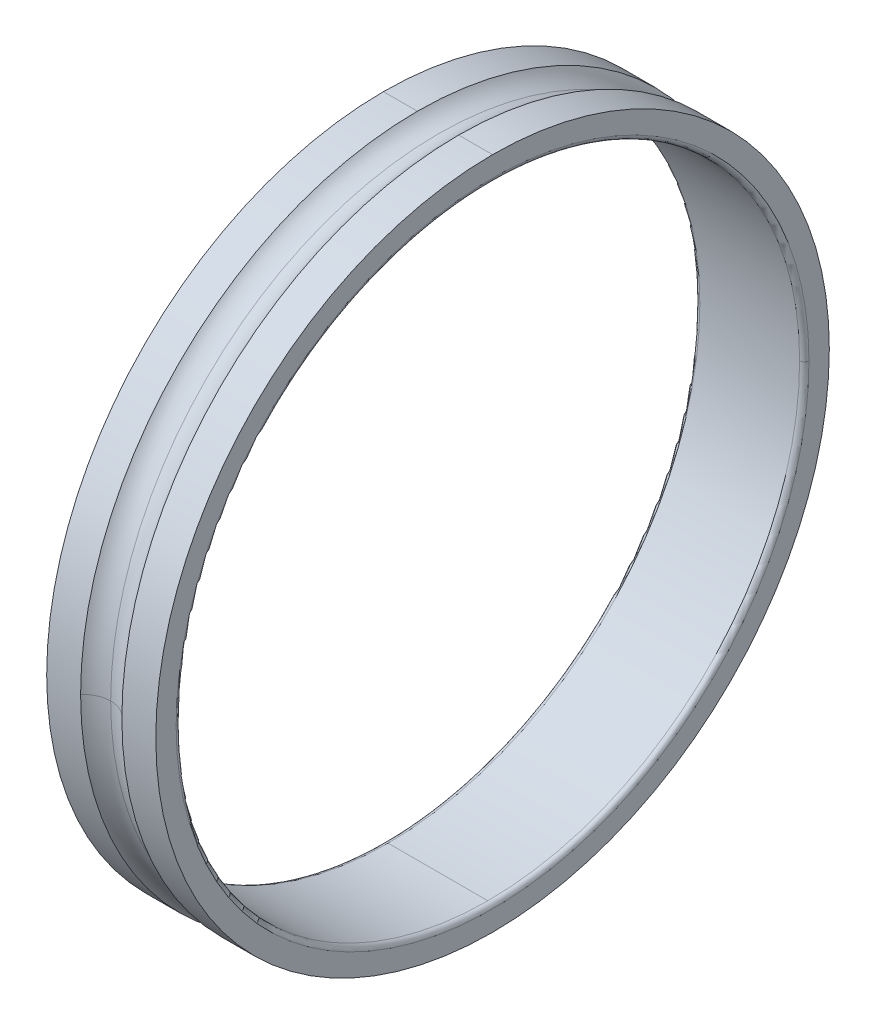
ISO-10303-21;
HEADER;
FILE_DESCRIPTION(('STEP AP214'),'2;1');
FILE_NAME('part.step','',(''),(''),'','','');
FILE_SCHEMA(('AUTOMOTIVE_DESIGN { 1 0 10303 214 1 1 1 1 }'));
ENDSEC;
DATA;
#1=APPLICATION_CONTEXT('core data for automotive mechanical design processes');
#2=APPLICATION_PROTOCOL_DEFINITION('international standard','automotive_design',2000,#1);
#3=PRODUCT_CONTEXT('',#1,'mechanical');
#4=PRODUCT('Part','Part','',(#3));
#5=PRODUCT_RELATED_PRODUCT_CATEGORY('part','',(#4));
#6=PRODUCT_DEFINITION_FORMATION('','',#4);
#7=PRODUCT_DEFINITION_CONTEXT('part definition',#1,'design');
#8=PRODUCT_DEFINITION('design','',#6,#7);
#9=PRODUCT_DEFINITION_SHAPE('','',#8);
#10=(LENGTH_UNIT() NAMED_UNIT(*) SI_UNIT(.MILLI.,.METRE.));
#11=(NAMED_UNIT(*) PLANE_ANGLE_UNIT() SI_UNIT($,.RADIAN.));
#12=(NAMED_UNIT(*) SI_UNIT($,.STERADIAN.) SOLID_ANGLE_UNIT());
#13=UNCERTAINTY_MEASURE_WITH_UNIT(LENGTH_MEASURE(1.E-05),#10,'distance_accuracy_value','');
#14=(GEOMETRIC_REPRESENTATION_CONTEXT(3) GLOBAL_UNCERTAINTY_ASSIGNED_CONTEXT((#13)) GLOBAL_UNIT_ASSIGNED_CONTEXT((#10,
#11,#12)) REPRESENTATION_CONTEXT('',''));
#15=CARTESIAN_POINT('',(0.,0.,0.));
#16=DIRECTION('',(0.,0.,1.));
#17=DIRECTION('',(1.,0.,0.));
#18=AXIS2_PLACEMENT_3D('',#15,#16,#17);
#19=CARTESIAN_POINT('',(5.91171651785338,0.,0.));
#20=DIRECTION('',(1.,0.,0.));
#21=DIRECTION('',(0.,1.,0.));
#22=AXIS2_PLACEMENT_3D('',#19,#20,#21);
#23=CYLINDRICAL_SURFACE('',#22,21.605);
#24=DIRECTION('',(1.,0.,0.));
#25=VECTOR('',#24,1.);
#26=CARTESIAN_POINT('',(5.91171651785338,21.605,0.));
#27=LINE('',#26,#25);
#28=CARTESIAN_POINT('',(4.82343303570677,21.605,0.));
#29=VERTEX_POINT('',#28);
#30=CARTESIAN_POINT('',(7.,21.605,0.));
#31=VERTEX_POINT('',#30);
#32=EDGE_CURVE('E158',#29,#31,#27,.T.);
#33=ORIENTED_EDGE('',*,*,#32,.T.);
#34=CARTESIAN_POINT('',(7.,0.,0.));
#35=DIRECTION('',(1.,0.,0.));
#36=DIRECTION('',(0.,1.,0.));
#37=AXIS2_PLACEMENT_3D('',#34,#35,#36);
#38=CIRCLE('',#37,21.605);
#39=CARTESIAN_POINT('',(7.,-21.605,0.));
#40=VERTEX_POINT('',#39);
#41=EDGE_CURVE('E168',#40,#31,#38,.T.);
#42=ORIENTED_EDGE('',*,*,#41,.F.);
#43=DIRECTION('',(-1.,0.,0.));
#44=VECTOR('',#43,1.);
#45=CARTESIAN_POINT('',(5.91171651785338,-21.605,0.));
#46=LINE('',#45,#44);
#47=CARTESIAN_POINT('',(4.82343303570677,-21.605,0.));
#48=VERTEX_POINT('',#47);
#49=EDGE_CURVE('E153',#40,#48,#46,.T.);
#50=ORIENTED_EDGE('',*,*,#49,.T.);
#51=CARTESIAN_POINT('',(4.82343303570677,0.,0.));
#52=DIRECTION('',(1.,0.,0.));
#53=DIRECTION('',(0.,1.,0.));
#54=AXIS2_PLACEMENT_3D('',#51,#52,#53);
#55=CIRCLE('',#54,21.605);
#56=CARTESIAN_POINT('',(4.82343303570677,0.,-21.605));
#57=VERTEX_POINT('',#56);
#58=EDGE_CURVE('E134',#48,#57,#55,.T.);
#59=ORIENTED_EDGE('',*,*,#58,.T.);
#60=CARTESIAN_POINT('',(4.82343303570677,0.,0.));
#61=DIRECTION('',(1.,0.,0.));
#62=DIRECTION('',(0.,1.,0.));
#63=AXIS2_PLACEMENT_3D('',#60,#61,#62);
#64=CIRCLE('',#63,21.605);
#65=EDGE_CURVE('E157',#57,#29,#64,.T.);
#66=ORIENTED_EDGE('',*,*,#65,.T.);
#67=EDGE_LOOP('',(#33,#42,#50,#59,#66));
#68=FACE_BOUND('',#67,.T.);
#69=ADVANCED_FACE('F17',(#68),#23,.T.);
#70=CARTESIAN_POINT('',(3.5,0.,0.));
#71=DIRECTION('',(1.,0.,0.));
#72=DIRECTION('',(0.,0.,-1.));
#73=AXIS2_PLACEMENT_3D('',#70,#71,#72);
#74=TOROIDAL_SURFACE('',#73,22.75,1.75);
#75=CARTESIAN_POINT('',(3.5,0.,0.));
#76=DIRECTION('',(-1.,0.,0.));
#77=DIRECTION('',(0.,0.,1.));
#78=AXIS2_PLACEMENT_3D('',#75,#76,#77);
#79=CIRCLE('',#78,21.);
#80=CARTESIAN_POINT('',(3.5,0.,21.));
#81=VERTEX_POINT('',#80);
#82=CARTESIAN_POINT('',(3.5,0.,-21.));
#83=VERTEX_POINT('',#82);
#84=EDGE_CURVE('E116',#81,#83,#79,.T.);
#85=ORIENTED_EDGE('',*,*,#84,.T.);
#86=CARTESIAN_POINT('',(3.5,0.,-22.75));
#87=DIRECTION('',(0.,-1.,0.));
#88=DIRECTION('',(0.,0.,-1.));
#89=AXIS2_PLACEMENT_3D('',#86,#87,#88);
#90=CIRCLE('',#89,1.75);
#91=CARTESIAN_POINT('',(2.17656696429324,0.,-21.605));
#92=VERTEX_POINT('',#91);
#93=EDGE_CURVE('E130',#83,#92,#90,.T.);
#94=ORIENTED_EDGE('',*,*,#93,.T.);
#95=CARTESIAN_POINT('',(2.17656696429324,0.,0.));
#96=DIRECTION('',(1.,0.,0.));
#97=DIRECTION('',(0.,1.,0.));
#98=AXIS2_PLACEMENT_3D('',#95,#96,#97);
#99=CIRCLE('',#98,21.605);
#100=CARTESIAN_POINT('',(2.17656696429324,21.605,0.));
#101=VERTEX_POINT('',#100);
#102=EDGE_CURVE('E11',#92,#101,#99,.T.);
#103=ORIENTED_EDGE('',*,*,#102,.T.);
#104=CARTESIAN_POINT('',(2.17656696429324,0.,0.));
#105=DIRECTION('',(1.,0.,0.));
#106=DIRECTION('',(0.,1.,0.));
#107=AXIS2_PLACEMENT_3D('',#104,#105,#106);
#108=CIRCLE('',#107,21.605);
#109=CARTESIAN_POINT('',(2.17656696429324,0.,21.605));
#110=VERTEX_POINT('',#109);
#111=EDGE_CURVE('E118',#101,#110,#108,.T.);
#112=ORIENTED_EDGE('',*,*,#111,.T.);
#113=CARTESIAN_POINT('',(3.5,0.,22.75));
#114=DIRECTION('',(0.,-1.,0.));
#115=DIRECTION('',(0.,0.,1.));
#116=AXIS2_PLACEMENT_3D('',#113,#114,#115);
#117=CIRCLE('',#116,1.75);
#118=EDGE_CURVE('E111',#110,#81,#117,.T.);
#119=ORIENTED_EDGE('',*,*,#118,.T.);
#120=EDGE_LOOP('',(#85,#94,#103,#112,#119));
#121=FACE_BOUND('',#120,.T.);
#122=ADVANCED_FACE('F113',(#121),#74,.F.);
#123=CARTESIAN_POINT('',(1.08828348214662,0.,0.));
#124=DIRECTION('',(1.,0.,0.));
#125=DIRECTION('',(0.,1.,0.));
#126=AXIS2_PLACEMENT_3D('',#123,#124,#125);
#127=CYLINDRICAL_SURFACE('',#126,21.605);
#128=DIRECTION('',(1.,0.,0.));
#129=VECTOR('',#128,1.);
#130=CARTESIAN_POINT('',(1.08828348214662,21.605,0.));
#131=LINE('',#130,#129);
#132=CARTESIAN_POINT('',(0.,21.605,0.));
#133=VERTEX_POINT('',#132);
#134=EDGE_CURVE('E174',#133,#101,#131,.T.);
#135=ORIENTED_EDGE('',*,*,#134,.T.);
#136=ORIENTED_EDGE('',*,*,#102,.F.);
#137=CARTESIAN_POINT('',(2.17656696429324,0.,0.));
#138=DIRECTION('',(1.,0.,0.));
#139=DIRECTION('',(0.,1.,0.));
#140=AXIS2_PLACEMENT_3D('',#137,#138,#139);
#141=CIRCLE('',#140,21.605);
#142=CARTESIAN_POINT('',(2.17656696429324,-21.605,0.));
#143=VERTEX_POINT('',#142);
#144=EDGE_CURVE('E171',#143,#92,#141,.T.);
#145=ORIENTED_EDGE('',*,*,#144,.F.);
#146=DIRECTION('',(-1.,0.,0.));
#147=VECTOR('',#146,1.);
#148=CARTESIAN_POINT('',(1.08828348214662,-21.605,0.));
#149=LINE('',#148,#147);
#150=CARTESIAN_POINT('',(0.,-21.605,0.));
#151=VERTEX_POINT('',#150);
#152=EDGE_CURVE('E180',#143,#151,#149,.T.);
#153=ORIENTED_EDGE('',*,*,#152,.T.);
#154=CARTESIAN_POINT('',(0.,0.,0.));
#155=DIRECTION('',(1.,0.,0.));
#156=DIRECTION('',(0.,1.,0.));
#157=AXIS2_PLACEMENT_3D('',#154,#155,#156);
#158=CIRCLE('',#157,21.605);
#159=EDGE_CURVE('E25',#151,#133,#158,.T.);
#160=ORIENTED_EDGE('',*,*,#159,.T.);
#161=EDGE_LOOP('',(#135,#136,#145,#153,#160));
#162=FACE_BOUND('',#161,.T.);
#163=ADVANCED_FACE('F227',(#162),#127,.T.);
#164=CARTESIAN_POINT('',(0.,20.9525,0.));
#165=DIRECTION('',(-1.,0.,0.));
#166=DIRECTION('',(0.,0.,1.));
#167=AXIS2_PLACEMENT_3D('',#164,#165,#166);
#168=PLANE('',#167);
#169=CARTESIAN_POINT('',(0.,0.,0.));
#170=DIRECTION('',(1.,0.,0.));
#171=DIRECTION('',(0.,1.,0.));
#172=AXIS2_PLACEMENT_3D('',#169,#170,#171);
#173=CIRCLE('',#172,20.3);
#174=CARTESIAN_POINT('',(0.,0.,20.3));
#175=VERTEX_POINT('',#174);
#176=CARTESIAN_POINT('',(0.,0.,-20.3));
#177=VERTEX_POINT('',#176);
#178=EDGE_CURVE('E224',#175,#177,#173,.T.);
#179=ORIENTED_EDGE('',*,*,#178,.T.);
#180=CARTESIAN_POINT('',(0.,0.,0.));
#181=DIRECTION('',(1.,0.,0.));
#182=DIRECTION('',(0.,1.,0.));
#183=AXIS2_PLACEMENT_3D('',#180,#181,#182);
#184=CIRCLE('',#183,20.3);
#185=EDGE_CURVE('E196',#177,#175,#184,.T.);
#186=ORIENTED_EDGE('',*,*,#185,.T.);
#187=EDGE_LOOP('',(#179,#186));
#188=FACE_BOUND('',#187,.T.);
#189=CARTESIAN_POINT('',(0.,0.,0.));
#190=DIRECTION('',(1.,0.,0.));
#191=DIRECTION('',(0.,1.,0.));
#192=AXIS2_PLACEMENT_3D('',#189,#190,#191);
#193=CIRCLE('',#192,21.605);
#194=EDGE_CURVE('E177',#133,#151,#193,.T.);
#195=ORIENTED_EDGE('',*,*,#194,.F.);
#196=ORIENTED_EDGE('',*,*,#159,.F.);
#197=EDGE_LOOP('',(#195,#196));
#198=FACE_BOUND('',#197,.T.);
#199=ADVANCED_FACE('F231',(#188,#198),#168,.T.);
#200=CARTESIAN_POINT('',(0.3,0.,0.));
#201=DIRECTION('',(1.,0.,0.));
#202=DIRECTION('',(0.,0.,-1.));
#203=AXIS2_PLACEMENT_3D('',#200,#201,#202);
#204=TOROIDAL_SURFACE('',#203,20.3,0.3);
#205=CARTESIAN_POINT('',(0.3,0.,-20.3));
#206=DIRECTION('',(0.,-1.,0.));
#207=DIRECTION('',(0.,0.,-1.));
#208=AXIS2_PLACEMENT_3D('',#205,#206,#207);
#209=CIRCLE('',#208,0.3);
#210=CARTESIAN_POINT('',(0.3,0.,-20.));
#211=VERTEX_POINT('',#210);
#212=EDGE_CURVE('E184',#211,#177,#209,.T.);
#213=ORIENTED_EDGE('',*,*,#212,.T.);
#214=ORIENTED_EDGE('',*,*,#178,.F.);
#215=CARTESIAN_POINT('',(0.3,0.,20.3));
#216=DIRECTION('',(0.,-1.,0.));
#217=DIRECTION('',(0.,0.,1.));
#218=AXIS2_PLACEMENT_3D('',#215,#216,#217);
#219=CIRCLE('',#218,0.3);
#220=CARTESIAN_POINT('',(0.3,0.,20.));
#221=VERTEX_POINT('',#220);
#222=EDGE_CURVE('E193',#175,#221,#219,.T.);
#223=ORIENTED_EDGE('',*,*,#222,.T.);
#224=CARTESIAN_POINT('',(0.3,0.,0.));
#225=DIRECTION('',(1.,0.,0.));
#226=DIRECTION('',(0.,1.,0.));
#227=AXIS2_PLACEMENT_3D('',#224,#225,#226);
#228=CIRCLE('',#227,20.);
#229=CARTESIAN_POINT('',(0.3,-20.,0.));
#230=VERTEX_POINT('',#229);
#231=EDGE_CURVE('E166',#221,#230,#228,.T.);
#232=ORIENTED_EDGE('',*,*,#231,.T.);
#233=CARTESIAN_POINT('',(0.3,0.,0.));
#234=DIRECTION('',(1.,0.,0.));
#235=DIRECTION('',(0.,1.,0.));
#236=AXIS2_PLACEMENT_3D('',#233,#234,#235);
#237=CIRCLE('',#236,20.);
#238=EDGE_CURVE('E202',#230,#211,#237,.T.);
#239=ORIENTED_EDGE('',*,*,#238,.T.);
#240=EDGE_LOOP('',(#213,#214,#223,#232,#239));
#241=FACE_BOUND('',#240,.T.);
#242=ADVANCED_FACE('F260',(#241),#204,.T.);
#243=CARTESIAN_POINT('',(3.5,0.,0.));
#244=DIRECTION('',(1.,0.,0.));
#245=DIRECTION('',(0.,1.,0.));
#246=AXIS2_PLACEMENT_3D('',#243,#244,#245);
#247=CYLINDRICAL_SURFACE('',#246,20.);
#248=DIRECTION('',(1.,0.,0.));
#249=VECTOR('',#248,1.);
#250=CARTESIAN_POINT('',(3.5,20.,0.));
#251=LINE('',#250,#249);
#252=CARTESIAN_POINT('',(0.3,20.,0.));
#253=VERTEX_POINT('',#252);
#254=CARTESIAN_POINT('',(6.7,20.,0.));
#255=VERTEX_POINT('',#254);
#256=EDGE_CURVE('E199',#253,#255,#251,.T.);
#257=ORIENTED_EDGE('',*,*,#256,.T.);
#258=CARTESIAN_POINT('',(6.7,0.,0.));
#259=DIRECTION('',(1.,0.,0.));
#260=DIRECTION('',(0.,1.,0.));
#261=AXIS2_PLACEMENT_3D('',#258,#259,#260);
#262=CIRCLE('',#261,20.);
#263=CARTESIAN_POINT('',(6.7,0.,20.));
#264=VERTEX_POINT('',#263);
#265=EDGE_CURVE('E220',#255,#264,#262,.T.);
#266=ORIENTED_EDGE('',*,*,#265,.T.);
#267=CARTESIAN_POINT('',(6.7,0.,0.));
#268=DIRECTION('',(1.,0.,0.));
#269=DIRECTION('',(0.,1.,0.));
#270=AXIS2_PLACEMENT_3D('',#267,#268,#269);
#271=CIRCLE('',#270,20.);
#272=CARTESIAN_POINT('',(6.7,-20.,0.));
#273=VERTEX_POINT('',#272);
#274=EDGE_CURVE('E32',#264,#273,#271,.T.);
#275=ORIENTED_EDGE('',*,*,#274,.T.);
#276=DIRECTION('',(-1.,0.,0.));
#277=VECTOR('',#276,1.);
#278=CARTESIAN_POINT('',(3.5,-20.,0.));
#279=LINE('',#278,#277);
#280=EDGE_CURVE('E204',#273,#230,#279,.T.);
#281=ORIENTED_EDGE('',*,*,#280,.T.);
#282=ORIENTED_EDGE('',*,*,#231,.F.);
#283=CARTESIAN_POINT('',(0.3,0.,0.));
#284=DIRECTION('',(1.,0.,0.));
#285=DIRECTION('',(0.,1.,0.));
#286=AXIS2_PLACEMENT_3D('',#283,#284,#285);
#287=CIRCLE('',#286,20.);
#288=EDGE_CURVE('E190',#253,#221,#287,.T.);
#289=ORIENTED_EDGE('',*,*,#288,.F.);
#290=EDGE_LOOP('',(#257,#266,#275,#281,#282,#289));
#291=FACE_BOUND('',#290,.T.);
#292=ADVANCED_FACE('F19',(#291),#247,.F.);
#293=CARTESIAN_POINT('',(6.7,0.,0.));
#294=DIRECTION('',(1.,0.,0.));
#295=DIRECTION('',(0.,0.,-1.));
#296=AXIS2_PLACEMENT_3D('',#293,#294,#295);
#297=TOROIDAL_SURFACE('',#296,20.3,0.3);
#298=CARTESIAN_POINT('',(6.7,0.,-20.3));
#299=DIRECTION('',(0.,-1.,0.));
#300=DIRECTION('',(0.,0.,-1.));
#301=AXIS2_PLACEMENT_3D('',#298,#299,#300);
#302=CIRCLE('',#301,0.3);
#303=CARTESIAN_POINT('',(7.,0.,-20.3));
#304=VERTEX_POINT('',#303);
#305=CARTESIAN_POINT('',(6.7,0.,-20.));
#306=VERTEX_POINT('',#305);
#307=EDGE_CURVE('E213',#304,#306,#302,.T.);
#308=ORIENTED_EDGE('',*,*,#307,.T.);
#309=CARTESIAN_POINT('',(6.7,0.,0.));
#310=DIRECTION('',(1.,0.,0.));
#311=DIRECTION('',(0.,1.,0.));
#312=AXIS2_PLACEMENT_3D('',#309,#310,#311);
#313=CIRCLE('',#312,20.);
#314=EDGE_CURVE('E207',#273,#306,#313,.T.);
#315=ORIENTED_EDGE('',*,*,#314,.F.);
#316=ORIENTED_EDGE('',*,*,#274,.F.);
#317=CARTESIAN_POINT('',(6.7,0.,20.3));
#318=DIRECTION('',(0.,-1.,0.));
#319=DIRECTION('',(0.,0.,1.));
#320=AXIS2_PLACEMENT_3D('',#317,#318,#319);
#321=CIRCLE('',#320,0.3);
#322=CARTESIAN_POINT('',(7.,0.,20.3));
#323=VERTEX_POINT('',#322);
#324=EDGE_CURVE('E218',#264,#323,#321,.T.);
#325=ORIENTED_EDGE('',*,*,#324,.T.);
#326=CARTESIAN_POINT('',(7.,0.,0.));
#327=DIRECTION('',(1.,0.,0.));
#328=DIRECTION('',(0.,1.,0.));
#329=AXIS2_PLACEMENT_3D('',#326,#327,#328);
#330=CIRCLE('',#329,20.3);
#331=EDGE_CURVE('E39',#323,#304,#330,.T.);
#332=ORIENTED_EDGE('',*,*,#331,.T.);
#333=EDGE_LOOP('',(#308,#315,#316,#325,#332));
#334=FACE_BOUND('',#333,.T.);
#335=ADVANCED_FACE('F267',(#334),#297,.T.);
#336=CARTESIAN_POINT('',(7.,20.9525,0.));
#337=DIRECTION('',(1.,0.,0.));
#338=DIRECTION('',(0.,1.,0.));
#339=AXIS2_PLACEMENT_3D('',#336,#337,#338);
#340=PLANE('',#339);
#341=CARTESIAN_POINT('',(7.,0.,0.));
#342=DIRECTION('',(1.,0.,0.));
#343=DIRECTION('',(0.,1.,0.));
#344=AXIS2_PLACEMENT_3D('',#341,#342,#343);
#345=CIRCLE('',#344,20.3);
#346=EDGE_CURVE('E215',#304,#323,#345,.T.);
#347=ORIENTED_EDGE('',*,*,#346,.F.);
#348=ORIENTED_EDGE('',*,*,#331,.F.);
#349=EDGE_LOOP('',(#347,#348));
#350=FACE_BOUND('',#349,.T.);
#351=CARTESIAN_POINT('',(7.,0.,0.));
#352=DIRECTION('',(1.,0.,0.));
#353=DIRECTION('',(0.,1.,0.));
#354=AXIS2_PLACEMENT_3D('',#351,#352,#353);
#355=CIRCLE('',#354,21.605);
#356=EDGE_CURVE('E123',#31,#40,#355,.T.);
#357=ORIENTED_EDGE('',*,*,#356,.T.);
#358=ORIENTED_EDGE('',*,*,#41,.T.);
#359=EDGE_LOOP('',(#357,#358));
#360=FACE_BOUND('',#359,.T.);
#361=ADVANCED_FACE('F284',(#350,#360),#340,.T.);
#362=CARTESIAN_POINT('',(6.7,0.,0.));
#363=DIRECTION('',(1.,0.,0.));
#364=DIRECTION('',(0.,0.,-1.));
#365=AXIS2_PLACEMENT_3D('',#362,#363,#364);
#366=TOROIDAL_SURFACE('',#365,20.3,0.3);
#367=ORIENTED_EDGE('',*,*,#307,.F.);
#368=ORIENTED_EDGE('',*,*,#346,.T.);
#369=ORIENTED_EDGE('',*,*,#324,.F.);
#370=ORIENTED_EDGE('',*,*,#265,.F.);
#371=CARTESIAN_POINT('',(6.7,0.,0.));
#372=DIRECTION('',(1.,0.,0.));
#373=DIRECTION('',(0.,1.,0.));
#374=AXIS2_PLACEMENT_3D('',#371,#372,#373);
#375=CIRCLE('',#374,20.);
#376=EDGE_CURVE('E210',#306,#255,#375,.T.);
#377=ORIENTED_EDGE('',*,*,#376,.F.);
#378=EDGE_LOOP('',(#367,#368,#369,#370,#377));
#379=FACE_BOUND('',#378,.T.);
#380=ADVANCED_FACE('F283',(#379),#366,.T.);
#381=CARTESIAN_POINT('',(3.5,0.,0.));
#382=DIRECTION('',(1.,0.,0.));
#383=DIRECTION('',(0.,1.,0.));
#384=AXIS2_PLACEMENT_3D('',#381,#382,#383);
#385=CYLINDRICAL_SURFACE('',#384,20.);
#386=ORIENTED_EDGE('',*,*,#256,.F.);
#387=CARTESIAN_POINT('',(0.3,0.,0.));
#388=DIRECTION('',(1.,0.,0.));
#389=DIRECTION('',(0.,1.,0.));
#390=AXIS2_PLACEMENT_3D('',#387,#388,#389);
#391=CIRCLE('',#390,20.);
#392=EDGE_CURVE('E187',#211,#253,#391,.T.);
#393=ORIENTED_EDGE('',*,*,#392,.F.);
#394=ORIENTED_EDGE('',*,*,#238,.F.);
#395=ORIENTED_EDGE('',*,*,#280,.F.);
#396=ORIENTED_EDGE('',*,*,#314,.T.);
#397=ORIENTED_EDGE('',*,*,#376,.T.);
#398=EDGE_LOOP('',(#386,#393,#394,#395,#396,#397));
#399=FACE_BOUND('',#398,.T.);
#400=ADVANCED_FACE('F244',(#399),#385,.F.);
#401=CARTESIAN_POINT('',(0.3,0.,0.));
#402=DIRECTION('',(1.,0.,0.));
#403=DIRECTION('',(0.,0.,-1.));
#404=AXIS2_PLACEMENT_3D('',#401,#402,#403);
#405=TOROIDAL_SURFACE('',#404,20.3,0.3);
#406=ORIENTED_EDGE('',*,*,#212,.F.);
#407=ORIENTED_EDGE('',*,*,#392,.T.);
#408=ORIENTED_EDGE('',*,*,#288,.T.);
#409=ORIENTED_EDGE('',*,*,#222,.F.);
#410=ORIENTED_EDGE('',*,*,#185,.F.);
#411=EDGE_LOOP('',(#406,#407,#408,#409,#410));
#412=FACE_BOUND('',#411,.T.);
#413=ADVANCED_FACE('F235',(#412),#405,.T.);
#414=CARTESIAN_POINT('',(1.08828348214662,0.,0.));
#415=DIRECTION('',(1.,0.,0.));
#416=DIRECTION('',(0.,1.,0.));
#417=AXIS2_PLACEMENT_3D('',#414,#415,#416);
#418=CYLINDRICAL_SURFACE('',#417,21.605);
#419=ORIENTED_EDGE('',*,*,#134,.F.);
#420=ORIENTED_EDGE('',*,*,#194,.T.);
#421=ORIENTED_EDGE('',*,*,#152,.F.);
#422=CARTESIAN_POINT('',(2.17656696429324,0.,0.));
#423=DIRECTION('',(1.,0.,0.));
#424=DIRECTION('',(0.,1.,0.));
#425=AXIS2_PLACEMENT_3D('',#422,#423,#424);
#426=CIRCLE('',#425,21.605);
#427=EDGE_CURVE('E122',#110,#143,#426,.T.);
#428=ORIENTED_EDGE('',*,*,#427,.F.);
#429=ORIENTED_EDGE('',*,*,#111,.F.);
#430=EDGE_LOOP('',(#419,#420,#421,#428,#429));
#431=FACE_BOUND('',#430,.T.);
#432=ADVANCED_FACE('F233',(#431),#418,.T.);
#433=CARTESIAN_POINT('',(3.5,0.,0.));
#434=DIRECTION('',(1.,0.,0.));
#435=DIRECTION('',(0.,0.,-1.));
#436=AXIS2_PLACEMENT_3D('',#433,#434,#435);
#437=TOROIDAL_SURFACE('',#436,22.75,1.75);
#438=CARTESIAN_POINT('',(3.5,0.,0.));
#439=DIRECTION('',(-1.,0.,0.));
#440=DIRECTION('',(0.,0.,1.));
#441=AXIS2_PLACEMENT_3D('',#438,#439,#440);
#442=CIRCLE('',#441,21.);
#443=EDGE_CURVE('E126',#83,#81,#442,.T.);
#444=ORIENTED_EDGE('',*,*,#443,.T.);
#445=ORIENTED_EDGE('',*,*,#118,.F.);
#446=ORIENTED_EDGE('',*,*,#427,.T.);
#447=ORIENTED_EDGE('',*,*,#144,.T.);
#448=ORIENTED_EDGE('',*,*,#93,.F.);
#449=EDGE_LOOP('',(#444,#445,#446,#447,#448));
#450=FACE_BOUND('',#449,.T.);
#451=ADVANCED_FACE('F128',(#450),#437,.F.);
#452=CARTESIAN_POINT('',(5.91171651785338,0.,0.));
#453=DIRECTION('',(1.,0.,0.));
#454=DIRECTION('',(0.,1.,0.));
#455=AXIS2_PLACEMENT_3D('',#452,#453,#454);
#456=CYLINDRICAL_SURFACE('',#455,21.605);
#457=ORIENTED_EDGE('',*,*,#32,.F.);
#458=CARTESIAN_POINT('',(4.82343303570677,0.,0.));
#459=DIRECTION('',(1.,0.,0.));
#460=DIRECTION('',(0.,1.,0.));
#461=AXIS2_PLACEMENT_3D('',#458,#459,#460);
#462=CIRCLE('',#461,21.605);
#463=CARTESIAN_POINT('',(4.82343303570677,0.,21.605));
#464=VERTEX_POINT('',#463);
#465=EDGE_CURVE('E146',#29,#464,#462,.T.);
#466=ORIENTED_EDGE('',*,*,#465,.T.);
#467=CARTESIAN_POINT('',(4.82343303570677,0.,0.));
#468=DIRECTION('',(1.,0.,0.));
#469=DIRECTION('',(0.,1.,0.));
#470=AXIS2_PLACEMENT_3D('',#467,#468,#469);
#471=CIRCLE('',#470,21.605);
#472=EDGE_CURVE('E142',#464,#48,#471,.T.);
#473=ORIENTED_EDGE('',*,*,#472,.T.);
#474=ORIENTED_EDGE('',*,*,#49,.F.);
#475=ORIENTED_EDGE('',*,*,#356,.F.);
#476=EDGE_LOOP('',(#457,#466,#473,#474,#475));
#477=FACE_BOUND('',#476,.T.);
#478=ADVANCED_FACE('F242',(#477),#456,.T.);
#479=CARTESIAN_POINT('',(3.5,0.,0.));
#480=DIRECTION('',(1.,0.,0.));
#481=DIRECTION('',(0.,0.,-1.));
#482=AXIS2_PLACEMENT_3D('',#479,#480,#481);
#483=TOROIDAL_SURFACE('',#482,22.75,1.75);
#484=ORIENTED_EDGE('',*,*,#443,.F.);
#485=CARTESIAN_POINT('',(3.5,0.,-22.75));
#486=DIRECTION('',(0.,-1.,0.));
#487=DIRECTION('',(0.,0.,-1.));
#488=AXIS2_PLACEMENT_3D('',#485,#486,#487);
#489=CIRCLE('',#488,1.75);
#490=EDGE_CURVE('E135',#57,#83,#489,.T.);
#491=ORIENTED_EDGE('',*,*,#490,.F.);
#492=ORIENTED_EDGE('',*,*,#58,.F.);
#493=ORIENTED_EDGE('',*,*,#472,.F.);
#494=CARTESIAN_POINT('',(3.5,0.,22.75));
#495=DIRECTION('',(0.,-1.,0.));
#496=DIRECTION('',(0.,0.,1.));
#497=AXIS2_PLACEMENT_3D('',#494,#495,#496);
#498=CIRCLE('',#497,1.75);
#499=EDGE_CURVE('E138',#81,#464,#498,.T.);
#500=ORIENTED_EDGE('',*,*,#499,.F.);
#501=EDGE_LOOP('',(#484,#491,#492,#493,#500));
#502=FACE_BOUND('',#501,.T.);
#503=ADVANCED_FACE('F139',(#502),#483,.F.);
#504=CARTESIAN_POINT('',(3.5,0.,0.));
#505=DIRECTION('',(1.,0.,0.));
#506=DIRECTION('',(0.,0.,-1.));
#507=AXIS2_PLACEMENT_3D('',#504,#505,#506);
#508=TOROIDAL_SURFACE('',#507,22.75,1.75);
#509=ORIENTED_EDGE('',*,*,#84,.F.);
#510=ORIENTED_EDGE('',*,*,#499,.T.);
#511=ORIENTED_EDGE('',*,*,#465,.F.);
#512=ORIENTED_EDGE('',*,*,#65,.F.);
#513=ORIENTED_EDGE('',*,*,#490,.T.);
#514=EDGE_LOOP('',(#509,#510,#511,#512,#513));
#515=FACE_BOUND('',#514,.T.);
#516=ADVANCED_FACE('F148',(#515),#508,.F.);
#517=CLOSED_SHELL('',(#69,#122,#163,#199,#242,#292,#335,#361,#380,#400,#413,#432,#451,#478,#503,#516));
#518=MANIFOLD_SOLID_BREP('B1',#517);
#519=ADVANCED_BREP_SHAPE_REPRESENTATION('',(#18,#518),#14);
#520=SHAPE_DEFINITION_REPRESENTATION(#9,#519);
ENDSEC;
END-ISO-10303-21;
